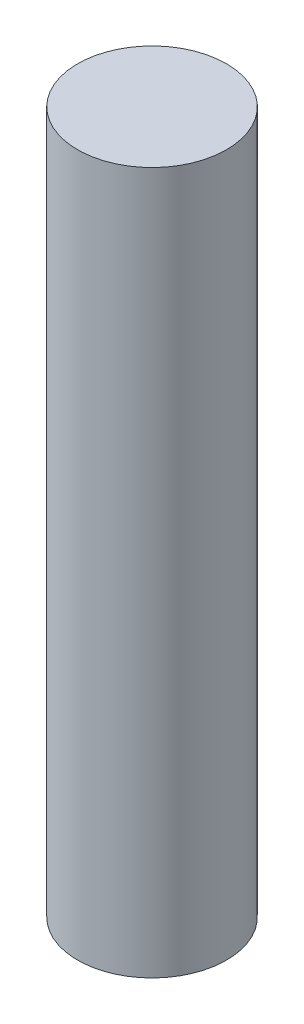
ISO-10303-21;
HEADER;
FILE_DESCRIPTION(('STEP AP214'),'2;1');
FILE_NAME('part.step','',(''),(''),'','','');
FILE_SCHEMA(('AUTOMOTIVE_DESIGN { 1 0 10303 214 1 1 1 1 }'));
ENDSEC;
DATA;
#1=APPLICATION_CONTEXT('core data for automotive mechanical design processes');
#2=APPLICATION_PROTOCOL_DEFINITION('international standard','automotive_design',2000,#1);
#3=PRODUCT_CONTEXT('',#1,'mechanical');
#4=PRODUCT('Part','Part','',(#3));
#5=PRODUCT_RELATED_PRODUCT_CATEGORY('part','',(#4));
#6=PRODUCT_DEFINITION_FORMATION('','',#4);
#7=PRODUCT_DEFINITION_CONTEXT('part definition',#1,'design');
#8=PRODUCT_DEFINITION('design','',#6,#7);
#9=PRODUCT_DEFINITION_SHAPE('','',#8);
#10=(LENGTH_UNIT() NAMED_UNIT(*) SI_UNIT(.MILLI.,.METRE.));
#11=(NAMED_UNIT(*) PLANE_ANGLE_UNIT() SI_UNIT($,.RADIAN.));
#12=(NAMED_UNIT(*) SI_UNIT($,.STERADIAN.) SOLID_ANGLE_UNIT());
#13=UNCERTAINTY_MEASURE_WITH_UNIT(LENGTH_MEASURE(1.E-05),#10,'distance_accuracy_value','');
#14=(GEOMETRIC_REPRESENTATION_CONTEXT(3) GLOBAL_UNCERTAINTY_ASSIGNED_CONTEXT((#13)) GLOBAL_UNIT_ASSIGNED_CONTEXT((#10,
#11,#12)) REPRESENTATION_CONTEXT('',''));
#15=CARTESIAN_POINT('',(0.,0.,0.));
#16=DIRECTION('',(0.,0.,1.));
#17=DIRECTION('',(1.,0.,0.));
#18=AXIS2_PLACEMENT_3D('',#15,#16,#17);
#19=CARTESIAN_POINT('',(0.,45.,0.));
#20=DIRECTION('',(0.,-1.,0.));
#21=DIRECTION('',(0.,0.,-1.));
#22=AXIS2_PLACEMENT_3D('',#19,#20,#21);
#23=CYLINDRICAL_SURFACE('',#22,4.775);
#24=CARTESIAN_POINT('',(0.,45.,0.));
#25=DIRECTION('',(0.,1.,0.));
#26=DIRECTION('',(0.,0.,1.));
#27=AXIS2_PLACEMENT_3D('',#24,#25,#26);
#28=CIRCLE('',#27,4.775);
#29=CARTESIAN_POINT('',(0.,45.,-4.775));
#30=VERTEX_POINT('',#29);
#31=EDGE_CURVE('E10',#30,#30,#28,.T.);
#32=CARTESIAN_POINT('',(0.,0.,0.));
#33=DIRECTION('',(0.,1.,0.));
#34=DIRECTION('',(0.,0.,1.));
#35=AXIS2_PLACEMENT_3D('',#32,#33,#34);
#36=CIRCLE('',#35,4.775);
#37=CARTESIAN_POINT('',(0.,0.,-4.775));
#38=VERTEX_POINT('',#37);
#39=EDGE_CURVE('E46',#38,#38,#36,.T.);
#40=CARTESIAN_POINT('',(0.,45.,-4.775));
#41=CARTESIAN_POINT('',(0.,44.53125,-4.775));
#42=CARTESIAN_POINT('',(0.,44.0625,-4.775));
#43=CARTESIAN_POINT('',(0.,43.125,-4.775));
#44=CARTESIAN_POINT('',(0.,42.65625,-4.775));
#45=CARTESIAN_POINT('',(0.,41.71875,-4.775));
#46=CARTESIAN_POINT('',(0.,41.25,-4.775));
#47=CARTESIAN_POINT('',(0.,40.3125,-4.775));
#48=CARTESIAN_POINT('',(0.,39.84375,-4.775));
#49=CARTESIAN_POINT('',(0.,38.90625,-4.775));
#50=CARTESIAN_POINT('',(0.,38.4375,-4.775));
#51=CARTESIAN_POINT('',(0.,37.5,-4.775));
#52=CARTESIAN_POINT('',(0.,37.03125,-4.775));
#53=CARTESIAN_POINT('',(0.,36.09375,-4.775));
#54=CARTESIAN_POINT('',(0.,35.625,-4.775));
#55=CARTESIAN_POINT('',(0.,34.6875,-4.775));
#56=CARTESIAN_POINT('',(0.,34.21875,-4.775));
#57=CARTESIAN_POINT('',(0.,33.28125,-4.775));
#58=CARTESIAN_POINT('',(0.,32.8125,-4.775));
#59=CARTESIAN_POINT('',(0.,31.875,-4.775));
#60=CARTESIAN_POINT('',(0.,31.40625,-4.775));
#61=CARTESIAN_POINT('',(0.,30.46875,-4.775));
#62=CARTESIAN_POINT('',(0.,30.,-4.775));
#63=CARTESIAN_POINT('',(0.,29.0625,-4.775));
#64=CARTESIAN_POINT('',(0.,28.59375,-4.775));
#65=CARTESIAN_POINT('',(0.,27.65625,-4.775));
#66=CARTESIAN_POINT('',(0.,27.1875,-4.775));
#67=CARTESIAN_POINT('',(0.,26.25,-4.775));
#68=CARTESIAN_POINT('',(0.,25.78125,-4.775));
#69=CARTESIAN_POINT('',(0.,24.84375,-4.775));
#70=CARTESIAN_POINT('',(0.,24.375,-4.775));
#71=CARTESIAN_POINT('',(0.,23.4375,-4.775));
#72=CARTESIAN_POINT('',(0.,22.96875,-4.775));
#73=CARTESIAN_POINT('',(0.,22.03125,-4.775));
#74=CARTESIAN_POINT('',(0.,21.5625,-4.775));
#75=CARTESIAN_POINT('',(0.,20.625,-4.775));
#76=CARTESIAN_POINT('',(0.,20.15625,-4.775));
#77=CARTESIAN_POINT('',(0.,19.21875,-4.775));
#78=CARTESIAN_POINT('',(0.,18.75,-4.775));
#79=CARTESIAN_POINT('',(0.,17.8125,-4.775));
#80=CARTESIAN_POINT('',(0.,17.34375,-4.775));
#81=CARTESIAN_POINT('',(0.,16.40625,-4.775));
#82=CARTESIAN_POINT('',(0.,15.9375,-4.775));
#83=CARTESIAN_POINT('',(0.,15.,-4.775));
#84=CARTESIAN_POINT('',(0.,14.53125,-4.775));
#85=CARTESIAN_POINT('',(0.,13.59375,-4.775));
#86=CARTESIAN_POINT('',(0.,13.125,-4.775));
#87=CARTESIAN_POINT('',(0.,12.1875,-4.775));
#88=CARTESIAN_POINT('',(0.,11.71875,-4.775));
#89=CARTESIAN_POINT('',(0.,10.78125,-4.775));
#90=CARTESIAN_POINT('',(0.,10.3125,-4.775));
#91=CARTESIAN_POINT('',(0.,9.37499999999999,-4.775));
#92=CARTESIAN_POINT('',(0.,8.90624999999999,-4.775));
#93=CARTESIAN_POINT('',(0.,7.96874999999999,-4.775));
#94=CARTESIAN_POINT('',(0.,7.5,-4.775));
#95=CARTESIAN_POINT('',(0.,6.56249999999999,-4.775));
#96=CARTESIAN_POINT('',(0.,6.09374999999999,-4.775));
#97=CARTESIAN_POINT('',(0.,5.15624999999999,-4.775));
#98=CARTESIAN_POINT('',(0.,4.68749999999999,-4.775));
#99=CARTESIAN_POINT('',(0.,3.74999999999999,-4.775));
#100=CARTESIAN_POINT('',(0.,3.28124999999999,-4.775));
#101=CARTESIAN_POINT('',(0.,2.34374999999999,-4.775));
#102=CARTESIAN_POINT('',(0.,1.87499999999999,-4.775));
#103=CARTESIAN_POINT('',(0.,0.937499999999992,-4.775));
#104=CARTESIAN_POINT('',(0.,0.468749999999993,-4.775));
#105=CARTESIAN_POINT('',(0.,0.,-4.775));
#106=B_SPLINE_CURVE_WITH_KNOTS('',3,(#40,#41,#42,#43,#44,#45,#46,#47,#48,#49,#50,#51,#52,#53,
#54,#55,#56,#57,#58,#59,#60,#61,#62,#63,#64,#65,#66,#67,#68,#69,#70,#71,#72,#73,#74,#75,#76,#77,
#78,#79,#80,#81,#82,#83,#84,#85,#86,#87,#88,#89,#90,#91,#92,#93,#94,#95,#96,#97,#98,#99,#100,
#101,#102,#103,#104,#105),.UNSPECIFIED.,.F.,.F.,(4,2,2,2,2,2,2,2,2,2,2,2,2,2,2,2,2,2,2,2,2,2,2,
2,2,2,2,2,2,2,2,2,4),(0.,1.40625,2.8125,4.21874999999999,5.625,7.03125,8.43749999999999,9.84375,
11.25,12.65625,14.0625,15.46875,16.875,18.28125,19.6875,21.09375,22.5,23.90625,25.3125,26.71875,
28.125,29.53125,30.9375,32.34375,33.75,35.15625,36.5625,37.96875,39.375,40.78125,42.1875,
43.59375,45.),.UNSPECIFIED.);
#107=EDGE_CURVE('BSEAM43',#30,#38,#106,.T.);
#108=ORIENTED_EDGE('',*,*,#31,.F.);
#109=ORIENTED_EDGE('',*,*,#39,.T.);
#110=ORIENTED_EDGE('',*,*,#107,.T.);
#111=ORIENTED_EDGE('',*,*,#107,.F.);
#112=EDGE_LOOP('',(#108,#110,#109,#111));
#113=FACE_BOUND('',#112,.T.);
#114=ADVANCED_FACE('F43',(#113),#23,.T.);
#115=CARTESIAN_POINT('',(0.,45.,0.));
#116=DIRECTION('',(0.,1.,0.));
#117=DIRECTION('',(0.,0.,1.));
#118=AXIS2_PLACEMENT_3D('',#115,#116,#117);
#119=PLANE('',#118);
#120=ORIENTED_EDGE('',*,*,#31,.T.);
#121=EDGE_LOOP('',(#120));
#122=FACE_BOUND('',#121,.T.);
#123=ADVANCED_FACE('F60',(#122),#119,.T.);
#124=CARTESIAN_POINT('',(0.,0.,0.));
#125=DIRECTION('',(0.,1.,0.));
#126=DIRECTION('',(0.,0.,1.));
#127=AXIS2_PLACEMENT_3D('',#124,#125,#126);
#128=PLANE('',#127);
#129=ORIENTED_EDGE('',*,*,#39,.F.);
#130=EDGE_LOOP('',(#129));
#131=FACE_BOUND('',#130,.T.);
#132=ADVANCED_FACE('F58',(#131),#128,.F.);
#133=CLOSED_SHELL('',(#114,#123,#132));
#134=MANIFOLD_SOLID_BREP('B2',#133);
#135=ADVANCED_BREP_SHAPE_REPRESENTATION('',(#18,#134),#14);
#136=SHAPE_DEFINITION_REPRESENTATION(#9,#135);
ENDSEC;
END-ISO-10303-21;
